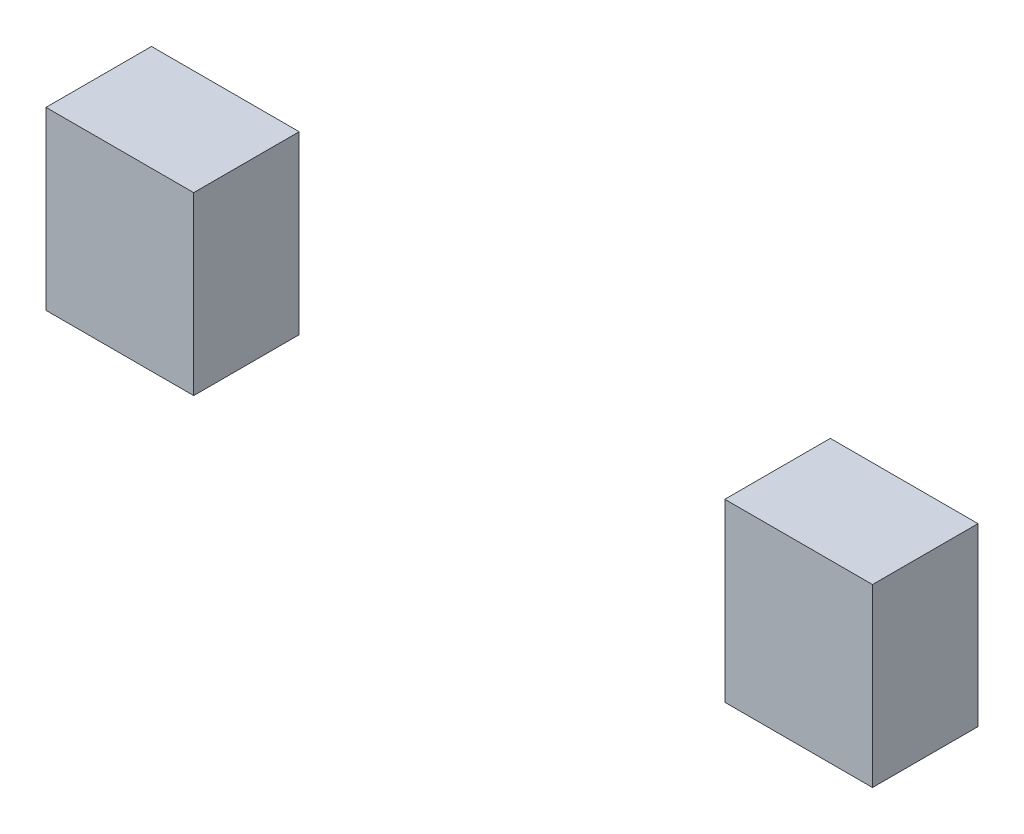
ISO-10303-21;
HEADER;
FILE_DESCRIPTION(('STEP AP214'),'2;1');
FILE_NAME('part.step','',(''),(''),'','','');
FILE_SCHEMA(('AUTOMOTIVE_DESIGN { 1 0 10303 214 1 1 1 1 }'));
ENDSEC;
DATA;
#1=APPLICATION_CONTEXT('core data for automotive mechanical design processes');
#2=APPLICATION_PROTOCOL_DEFINITION('international standard','automotive_design',2000,#1);
#3=PRODUCT_CONTEXT('',#1,'mechanical');
#4=PRODUCT('Part','Part','',(#3));
#5=PRODUCT_RELATED_PRODUCT_CATEGORY('part','',(#4));
#6=PRODUCT_DEFINITION_FORMATION('','',#4);
#7=PRODUCT_DEFINITION_CONTEXT('part definition',#1,'design');
#8=PRODUCT_DEFINITION('design','',#6,#7);
#9=PRODUCT_DEFINITION_SHAPE('','',#8);
#10=(LENGTH_UNIT() NAMED_UNIT(*) SI_UNIT(.MILLI.,.METRE.));
#11=(NAMED_UNIT(*) PLANE_ANGLE_UNIT() SI_UNIT($,.RADIAN.));
#12=(NAMED_UNIT(*) SI_UNIT($,.STERADIAN.) SOLID_ANGLE_UNIT());
#13=UNCERTAINTY_MEASURE_WITH_UNIT(LENGTH_MEASURE(1.E-05),#10,'distance_accuracy_value','');
#14=(GEOMETRIC_REPRESENTATION_CONTEXT(3) GLOBAL_UNCERTAINTY_ASSIGNED_CONTEXT((#13)) GLOBAL_UNIT_ASSIGNED_CONTEXT((#10,
#11,#12)) REPRESENTATION_CONTEXT('',''));
#15=CARTESIAN_POINT('',(0.,0.,0.));
#16=DIRECTION('',(0.,0.,1.));
#17=DIRECTION('',(1.,0.,0.));
#18=AXIS2_PLACEMENT_3D('',#15,#16,#17);
#19=CARTESIAN_POINT('',(20.052,-2.5,-19.55));
#20=DIRECTION('',(1.,0.,0.));
#21=DIRECTION('',(0.,0.,-1.));
#22=AXIS2_PLACEMENT_3D('',#19,#20,#21);
#23=PLANE('',#22);
#24=DIRECTION('',(0.,-1.,0.));
#25=VECTOR('',#24,1.);
#26=CARTESIAN_POINT('',(20.052,-2.5,-22.55));
#27=LINE('',#26,#25);
#28=CARTESIAN_POINT('',(20.052,2.5,-22.55));
#29=VERTEX_POINT('',#28);
#30=CARTESIAN_POINT('',(20.052,-2.5,-22.55));
#31=VERTEX_POINT('',#30);
#32=EDGE_CURVE('E115',#29,#31,#27,.T.);
#33=ORIENTED_EDGE('',*,*,#32,.T.);
#34=DIRECTION('',(0.,0.,-1.));
#35=VECTOR('',#34,1.);
#36=CARTESIAN_POINT('',(20.052,-2.5,-19.55));
#37=LINE('',#36,#35);
#38=CARTESIAN_POINT('',(20.052,-2.5,-19.55));
#39=VERTEX_POINT('',#38);
#40=EDGE_CURVE('E12',#39,#31,#37,.T.);
#41=ORIENTED_EDGE('',*,*,#40,.F.);
#42=DIRECTION('',(0.,-1.,0.));
#43=VECTOR('',#42,1.);
#44=CARTESIAN_POINT('',(20.052,-2.5,-19.55));
#45=LINE('',#44,#43);
#46=CARTESIAN_POINT('',(20.052,2.5,-19.55));
#47=VERTEX_POINT('',#46);
#48=EDGE_CURVE('E99',#47,#39,#45,.T.);
#49=ORIENTED_EDGE('',*,*,#48,.F.);
#50=DIRECTION('',(0.,0.,-1.));
#51=VECTOR('',#50,1.);
#52=CARTESIAN_POINT('',(20.052,2.5,-19.55));
#53=LINE('',#52,#51);
#54=EDGE_CURVE('E107',#47,#29,#53,.T.);
#55=ORIENTED_EDGE('',*,*,#54,.T.);
#56=EDGE_LOOP('',(#33,#41,#49,#55));
#57=FACE_BOUND('',#56,.T.);
#58=ADVANCED_FACE('F47',(#57),#23,.F.);
#59=CARTESIAN_POINT('',(20.052,-2.5,-19.55));
#60=DIRECTION('',(0.,1.,0.));
#61=DIRECTION('',(0.,0.,1.));
#62=AXIS2_PLACEMENT_3D('',#59,#60,#61);
#63=PLANE('',#62);
#64=DIRECTION('',(1.,0.,0.));
#65=VECTOR('',#64,1.);
#66=CARTESIAN_POINT('',(20.052,-2.5,-22.55));
#67=LINE('',#66,#65);
#68=CARTESIAN_POINT('',(24.252,-2.5,-22.55));
#69=VERTEX_POINT('',#68);
#70=EDGE_CURVE('E102',#31,#69,#67,.T.);
#71=ORIENTED_EDGE('',*,*,#70,.T.);
#72=DIRECTION('',(0.,0.,-1.));
#73=VECTOR('',#72,1.);
#74=CARTESIAN_POINT('',(24.252,-2.5,-19.55));
#75=LINE('',#74,#73);
#76=CARTESIAN_POINT('',(24.252,-2.5,-19.55));
#77=VERTEX_POINT('',#76);
#78=EDGE_CURVE('E60',#77,#69,#75,.T.);
#79=ORIENTED_EDGE('',*,*,#78,.F.);
#80=DIRECTION('',(1.,0.,0.));
#81=VECTOR('',#80,1.);
#82=CARTESIAN_POINT('',(20.052,-2.5,-19.55));
#83=LINE('',#82,#81);
#84=EDGE_CURVE('E92',#39,#77,#83,.T.);
#85=ORIENTED_EDGE('',*,*,#84,.F.);
#86=ORIENTED_EDGE('',*,*,#40,.T.);
#87=EDGE_LOOP('',(#71,#79,#85,#86));
#88=FACE_BOUND('',#87,.T.);
#89=ADVANCED_FACE('F103',(#88),#63,.F.);
#90=CARTESIAN_POINT('',(24.252,-2.5,-19.55));
#91=DIRECTION('',(-1.,0.,0.));
#92=DIRECTION('',(0.,0.,1.));
#93=AXIS2_PLACEMENT_3D('',#90,#91,#92);
#94=PLANE('',#93);
#95=DIRECTION('',(0.,1.,0.));
#96=VECTOR('',#95,1.);
#97=CARTESIAN_POINT('',(24.252,-2.5,-22.55));
#98=LINE('',#97,#96);
#99=CARTESIAN_POINT('',(24.252,2.5,-22.55));
#100=VERTEX_POINT('',#99);
#101=EDGE_CURVE('E85',#69,#100,#98,.T.);
#102=ORIENTED_EDGE('',*,*,#101,.T.);
#103=DIRECTION('',(0.,0.,-1.));
#104=VECTOR('',#103,1.);
#105=CARTESIAN_POINT('',(24.252,2.5,-19.55));
#106=LINE('',#105,#104);
#107=CARTESIAN_POINT('',(24.252,2.5,-19.55));
#108=VERTEX_POINT('',#107);
#109=EDGE_CURVE('E104',#108,#100,#106,.T.);
#110=ORIENTED_EDGE('',*,*,#109,.F.);
#111=DIRECTION('',(0.,1.,0.));
#112=VECTOR('',#111,1.);
#113=CARTESIAN_POINT('',(24.252,-2.5,-19.55));
#114=LINE('',#113,#112);
#115=EDGE_CURVE('E98',#77,#108,#114,.T.);
#116=ORIENTED_EDGE('',*,*,#115,.F.);
#117=ORIENTED_EDGE('',*,*,#78,.T.);
#118=EDGE_LOOP('',(#102,#110,#116,#117));
#119=FACE_BOUND('',#118,.T.);
#120=ADVANCED_FACE('F106',(#119),#94,.F.);
#121=CARTESIAN_POINT('',(20.052,2.5,-19.55));
#122=DIRECTION('',(0.,-1.,0.));
#123=DIRECTION('',(0.,0.,-1.));
#124=AXIS2_PLACEMENT_3D('',#121,#122,#123);
#125=PLANE('',#124);
#126=DIRECTION('',(-1.,0.,0.));
#127=VECTOR('',#126,1.);
#128=CARTESIAN_POINT('',(20.052,2.5,-22.55));
#129=LINE('',#128,#127);
#130=EDGE_CURVE('E86',#100,#29,#129,.T.);
#131=ORIENTED_EDGE('',*,*,#130,.T.);
#132=ORIENTED_EDGE('',*,*,#54,.F.);
#133=DIRECTION('',(-1.,0.,0.));
#134=VECTOR('',#133,1.);
#135=CARTESIAN_POINT('',(20.052,2.5,-19.55));
#136=LINE('',#135,#134);
#137=EDGE_CURVE('E63',#108,#47,#136,.T.);
#138=ORIENTED_EDGE('',*,*,#137,.F.);
#139=ORIENTED_EDGE('',*,*,#109,.T.);
#140=EDGE_LOOP('',(#131,#132,#138,#139));
#141=FACE_BOUND('',#140,.T.);
#142=ADVANCED_FACE('F116',(#141),#125,.F.);
#143=CARTESIAN_POINT('',(0.,0.,-19.55));
#144=DIRECTION('',(0.,0.,-1.));
#145=DIRECTION('',(-1.,0.,0.));
#146=AXIS2_PLACEMENT_3D('',#143,#144,#145);
#147=PLANE('',#146);
#148=ORIENTED_EDGE('',*,*,#48,.T.);
#149=ORIENTED_EDGE('',*,*,#84,.T.);
#150=ORIENTED_EDGE('',*,*,#115,.T.);
#151=ORIENTED_EDGE('',*,*,#137,.T.);
#152=EDGE_LOOP('',(#148,#149,#150,#151));
#153=FACE_BOUND('',#152,.T.);
#154=ADVANCED_FACE('F96',(#153),#147,.F.);
#155=CARTESIAN_POINT('',(0.,0.,-22.55));
#156=DIRECTION('',(0.,0.,-1.));
#157=DIRECTION('',(-1.,0.,0.));
#158=AXIS2_PLACEMENT_3D('',#155,#156,#157);
#159=PLANE('',#158);
#160=ORIENTED_EDGE('',*,*,#32,.F.);
#161=ORIENTED_EDGE('',*,*,#130,.F.);
#162=ORIENTED_EDGE('',*,*,#101,.F.);
#163=ORIENTED_EDGE('',*,*,#70,.F.);
#164=EDGE_LOOP('',(#160,#161,#162,#163));
#165=FACE_BOUND('',#164,.T.);
#166=ADVANCED_FACE('F125',(#165),#159,.T.);
#167=CLOSED_SHELL('',(#58,#89,#120,#142,#154,#166));
#168=MANIFOLD_SOLID_BREP('B2',#167);
#169=CARTESIAN_POINT('',(0.748000000000001,-2.5,-19.55));
#170=DIRECTION('',(1.,0.,0.));
#171=DIRECTION('',(0.,0.,-1.));
#172=AXIS2_PLACEMENT_3D('',#169,#170,#171);
#173=PLANE('',#172);
#174=DIRECTION('',(0.,-1.,0.));
#175=VECTOR('',#174,1.);
#176=CARTESIAN_POINT('',(0.748000000000001,-2.5,-22.55));
#177=LINE('',#176,#175);
#178=CARTESIAN_POINT('',(0.748000000000001,2.5,-22.55));
#179=VERTEX_POINT('',#178);
#180=CARTESIAN_POINT('',(0.748000000000001,-2.5,-22.55));
#181=VERTEX_POINT('',#180);
#182=EDGE_CURVE('E237',#179,#181,#177,.T.);
#183=ORIENTED_EDGE('',*,*,#182,.T.);
#184=DIRECTION('',(0.,0.,-1.));
#185=VECTOR('',#184,1.);
#186=CARTESIAN_POINT('',(0.748000000000001,-2.5,-19.55));
#187=LINE('',#186,#185);
#188=CARTESIAN_POINT('',(0.748000000000001,-2.5,-19.55));
#189=VERTEX_POINT('',#188);
#190=EDGE_CURVE('E50',#189,#181,#187,.T.);
#191=ORIENTED_EDGE('',*,*,#190,.F.);
#192=DIRECTION('',(0.,-1.,0.));
#193=VECTOR('',#192,1.);
#194=CARTESIAN_POINT('',(0.748000000000001,-2.5,-19.55));
#195=LINE('',#194,#193);
#196=CARTESIAN_POINT('',(0.748000000000001,2.5,-19.55));
#197=VERTEX_POINT('',#196);
#198=EDGE_CURVE('E221',#197,#189,#195,.T.);
#199=ORIENTED_EDGE('',*,*,#198,.F.);
#200=DIRECTION('',(0.,0.,-1.));
#201=VECTOR('',#200,1.);
#202=CARTESIAN_POINT('',(0.748000000000001,2.5,-19.55));
#203=LINE('',#202,#201);
#204=EDGE_CURVE('E235',#197,#179,#203,.T.);
#205=ORIENTED_EDGE('',*,*,#204,.T.);
#206=EDGE_LOOP('',(#183,#191,#199,#205));
#207=FACE_BOUND('',#206,.T.);
#208=ADVANCED_FACE('F174',(#207),#173,.F.);
#209=CARTESIAN_POINT('',(0.748000000000001,-2.5,-19.55));
#210=DIRECTION('',(0.,1.,0.));
#211=DIRECTION('',(0.,0.,1.));
#212=AXIS2_PLACEMENT_3D('',#209,#210,#211);
#213=PLANE('',#212);
#214=DIRECTION('',(1.,0.,0.));
#215=VECTOR('',#214,1.);
#216=CARTESIAN_POINT('',(0.748000000000001,-2.5,-22.55));
#217=LINE('',#216,#215);
#218=CARTESIAN_POINT('',(4.948,-2.5,-22.55));
#219=VERTEX_POINT('',#218);
#220=EDGE_CURVE('E229',#181,#219,#217,.T.);
#221=ORIENTED_EDGE('',*,*,#220,.T.);
#222=DIRECTION('',(0.,0.,-1.));
#223=VECTOR('',#222,1.);
#224=CARTESIAN_POINT('',(4.948,-2.5,-19.55));
#225=LINE('',#224,#223);
#226=CARTESIAN_POINT('',(4.948,-2.5,-19.55));
#227=VERTEX_POINT('',#226);
#228=EDGE_CURVE('E182',#227,#219,#225,.T.);
#229=ORIENTED_EDGE('',*,*,#228,.F.);
#230=DIRECTION('',(1.,0.,0.));
#231=VECTOR('',#230,1.);
#232=CARTESIAN_POINT('',(0.748000000000001,-2.5,-19.55));
#233=LINE('',#232,#231);
#234=EDGE_CURVE('E218',#189,#227,#233,.T.);
#235=ORIENTED_EDGE('',*,*,#234,.F.);
#236=ORIENTED_EDGE('',*,*,#190,.T.);
#237=EDGE_LOOP('',(#221,#229,#235,#236));
#238=FACE_BOUND('',#237,.T.);
#239=ADVANCED_FACE('F230',(#238),#213,.F.);
#240=CARTESIAN_POINT('',(4.948,-2.5,-19.55));
#241=DIRECTION('',(-1.,0.,0.));
#242=DIRECTION('',(0.,0.,1.));
#243=AXIS2_PLACEMENT_3D('',#240,#241,#242);
#244=PLANE('',#243);
#245=DIRECTION('',(0.,1.,0.));
#246=VECTOR('',#245,1.);
#247=CARTESIAN_POINT('',(4.948,-2.5,-22.55));
#248=LINE('',#247,#246);
#249=CARTESIAN_POINT('',(4.948,2.5,-22.55));
#250=VERTEX_POINT('',#249);
#251=EDGE_CURVE('E206',#219,#250,#248,.T.);
#252=ORIENTED_EDGE('',*,*,#251,.T.);
#253=DIRECTION('',(0.,0.,-1.));
#254=VECTOR('',#253,1.);
#255=CARTESIAN_POINT('',(4.948,2.5,-19.55));
#256=LINE('',#255,#254);
#257=CARTESIAN_POINT('',(4.948,2.5,-19.55));
#258=VERTEX_POINT('',#257);
#259=EDGE_CURVE('E226',#258,#250,#256,.T.);
#260=ORIENTED_EDGE('',*,*,#259,.F.);
#261=DIRECTION('',(0.,1.,0.));
#262=VECTOR('',#261,1.);
#263=CARTESIAN_POINT('',(4.948,-2.5,-19.55));
#264=LINE('',#263,#262);
#265=EDGE_CURVE('E225',#227,#258,#264,.T.);
#266=ORIENTED_EDGE('',*,*,#265,.F.);
#267=ORIENTED_EDGE('',*,*,#228,.T.);
#268=EDGE_LOOP('',(#252,#260,#266,#267));
#269=FACE_BOUND('',#268,.T.);
#270=ADVANCED_FACE('F228',(#269),#244,.F.);
#271=CARTESIAN_POINT('',(0.748000000000001,2.5,-19.55));
#272=DIRECTION('',(0.,-1.,0.));
#273=DIRECTION('',(0.,0.,-1.));
#274=AXIS2_PLACEMENT_3D('',#271,#272,#273);
#275=PLANE('',#274);
#276=DIRECTION('',(-1.,0.,0.));
#277=VECTOR('',#276,1.);
#278=CARTESIAN_POINT('',(0.748000000000001,2.5,-22.55));
#279=LINE('',#278,#277);
#280=EDGE_CURVE('E215',#250,#179,#279,.T.);
#281=ORIENTED_EDGE('',*,*,#280,.T.);
#282=ORIENTED_EDGE('',*,*,#204,.F.);
#283=DIRECTION('',(-1.,0.,0.));
#284=VECTOR('',#283,1.);
#285=CARTESIAN_POINT('',(0.748000000000001,2.5,-19.55));
#286=LINE('',#285,#284);
#287=EDGE_CURVE('E186',#258,#197,#286,.T.);
#288=ORIENTED_EDGE('',*,*,#287,.F.);
#289=ORIENTED_EDGE('',*,*,#259,.T.);
#290=EDGE_LOOP('',(#281,#282,#288,#289));
#291=FACE_BOUND('',#290,.T.);
#292=ADVANCED_FACE('F244',(#291),#275,.F.);
#293=CARTESIAN_POINT('',(0.,0.,-19.55));
#294=DIRECTION('',(0.,0.,-1.));
#295=DIRECTION('',(-1.,0.,0.));
#296=AXIS2_PLACEMENT_3D('',#293,#294,#295);
#297=PLANE('',#296);
#298=ORIENTED_EDGE('',*,*,#198,.T.);
#299=ORIENTED_EDGE('',*,*,#234,.T.);
#300=ORIENTED_EDGE('',*,*,#265,.T.);
#301=ORIENTED_EDGE('',*,*,#287,.T.);
#302=EDGE_LOOP('',(#298,#299,#300,#301));
#303=FACE_BOUND('',#302,.T.);
#304=ADVANCED_FACE('F219',(#303),#297,.F.);
#305=CARTESIAN_POINT('',(0.,0.,-22.55));
#306=DIRECTION('',(0.,0.,-1.));
#307=DIRECTION('',(-1.,0.,0.));
#308=AXIS2_PLACEMENT_3D('',#305,#306,#307);
#309=PLANE('',#308);
#310=ORIENTED_EDGE('',*,*,#182,.F.);
#311=ORIENTED_EDGE('',*,*,#280,.F.);
#312=ORIENTED_EDGE('',*,*,#251,.F.);
#313=ORIENTED_EDGE('',*,*,#220,.F.);
#314=EDGE_LOOP('',(#310,#311,#312,#313));
#315=FACE_BOUND('',#314,.T.);
#316=ADVANCED_FACE('F246',(#315),#309,.T.);
#317=CLOSED_SHELL('',(#208,#239,#270,#292,#304,#316));
#318=MANIFOLD_SOLID_BREP('B6',#317);
#319=ADVANCED_BREP_SHAPE_REPRESENTATION('',(#18,#168,#318),#14);
#320=SHAPE_DEFINITION_REPRESENTATION(#9,#319);
ENDSEC;
END-ISO-10303-21;
